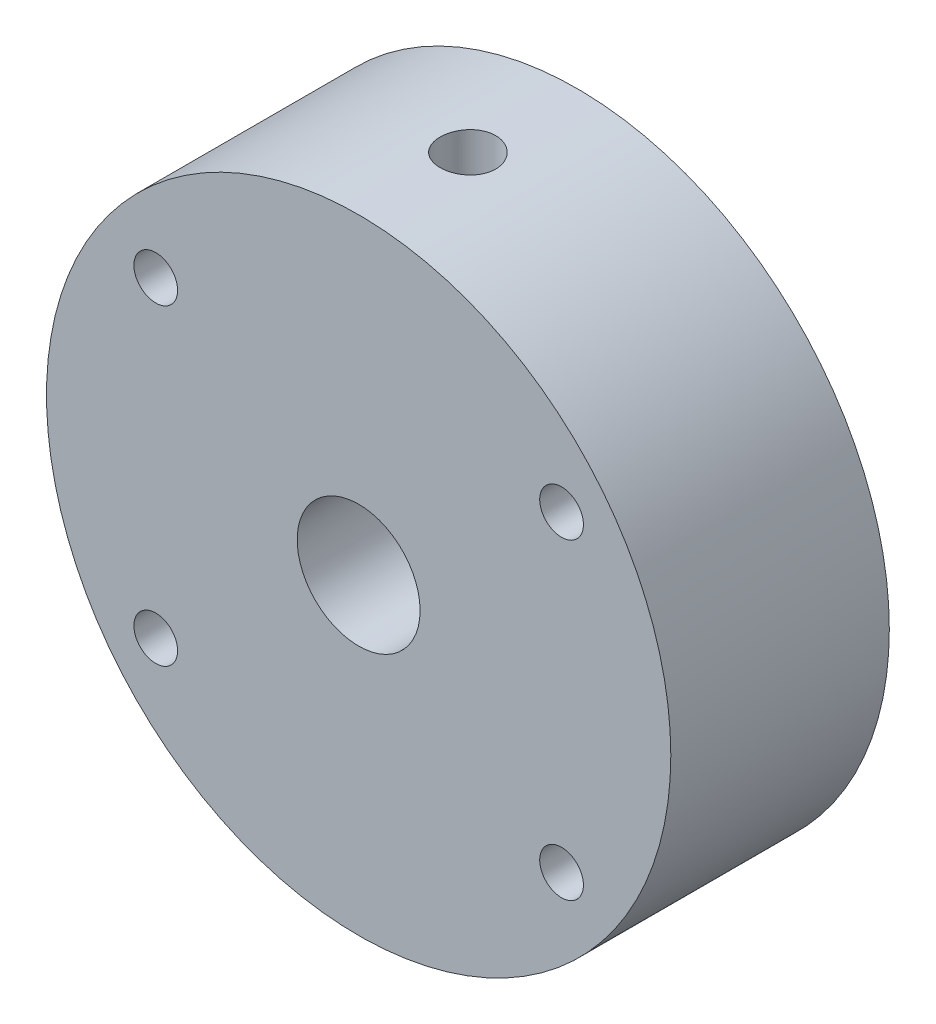
ISO-10303-21;
HEADER;
FILE_DESCRIPTION(('STEP AP214'),'2;1');
FILE_NAME('part.step','',(''),(''),'','','');
FILE_SCHEMA(('AUTOMOTIVE_DESIGN { 1 0 10303 214 1 1 1 1 }'));
ENDSEC;
DATA;
#1=APPLICATION_CONTEXT('core data for automotive mechanical design processes');
#2=APPLICATION_PROTOCOL_DEFINITION('international standard','automotive_design',2000,#1);
#3=PRODUCT_CONTEXT('',#1,'mechanical');
#4=PRODUCT('Part','Part','',(#3));
#5=PRODUCT_RELATED_PRODUCT_CATEGORY('part','',(#4));
#6=PRODUCT_DEFINITION_FORMATION('','',#4);
#7=PRODUCT_DEFINITION_CONTEXT('part definition',#1,'design');
#8=PRODUCT_DEFINITION('design','',#6,#7);
#9=PRODUCT_DEFINITION_SHAPE('','',#8);
#10=(LENGTH_UNIT() NAMED_UNIT(*) SI_UNIT(.MILLI.,.METRE.));
#11=(NAMED_UNIT(*) PLANE_ANGLE_UNIT() SI_UNIT($,.RADIAN.));
#12=(NAMED_UNIT(*) SI_UNIT($,.STERADIAN.) SOLID_ANGLE_UNIT());
#13=UNCERTAINTY_MEASURE_WITH_UNIT(LENGTH_MEASURE(1.E-05),#10,'distance_accuracy_value','');
#14=(GEOMETRIC_REPRESENTATION_CONTEXT(3) GLOBAL_UNCERTAINTY_ASSIGNED_CONTEXT((#13)) GLOBAL_UNIT_ASSIGNED_CONTEXT((#10,
#11,#12)) REPRESENTATION_CONTEXT('',''));
#15=CARTESIAN_POINT('',(0.,0.,0.));
#16=DIRECTION('',(0.,0.,1.));
#17=DIRECTION('',(1.,0.,0.));
#18=AXIS2_PLACEMENT_3D('',#15,#16,#17);
#19=CARTESIAN_POINT('',(0.,0.,8.89));
#20=DIRECTION('',(0.,0.,1.));
#21=DIRECTION('',(1.,0.,0.));
#22=AXIS2_PLACEMENT_3D('',#19,#20,#21);
#23=PLANE('',#22);
#24=CARTESIAN_POINT('',(-8.255,6.35,8.89));
#25=DIRECTION('',(0.,0.,1.));
#26=DIRECTION('',(1.,0.,0.));
#27=AXIS2_PLACEMENT_3D('',#24,#25,#26);
#28=CIRCLE('',#27,0.888999999999987);
#29=CARTESIAN_POINT('',(-7.36600000000001,6.35,8.89));
#30=VERTEX_POINT('',#29);
#31=EDGE_CURVE('E81',#30,#30,#28,.T.);
#32=ORIENTED_EDGE('',*,*,#31,.F.);
#33=EDGE_LOOP('',(#32));
#34=FACE_BOUND('',#33,.T.);
#35=CARTESIAN_POINT('',(8.255,6.35,8.89));
#36=DIRECTION('',(0.,0.,1.));
#37=DIRECTION('',(1.,0.,0.));
#38=AXIS2_PLACEMENT_3D('',#35,#36,#37);
#39=CIRCLE('',#38,0.888999999999987);
#40=CARTESIAN_POINT('',(9.14399999999999,6.35,8.89));
#41=VERTEX_POINT('',#40);
#42=EDGE_CURVE('E75',#41,#41,#39,.T.);
#43=ORIENTED_EDGE('',*,*,#42,.F.);
#44=EDGE_LOOP('',(#43));
#45=FACE_BOUND('',#44,.T.);
#46=CARTESIAN_POINT('',(8.255,-6.35,8.89));
#47=DIRECTION('',(0.,0.,1.));
#48=DIRECTION('',(1.,0.,0.));
#49=AXIS2_PLACEMENT_3D('',#46,#47,#48);
#50=CIRCLE('',#49,0.888999999999987);
#51=CARTESIAN_POINT('',(9.14399999999999,-6.35,8.89));
#52=VERTEX_POINT('',#51);
#53=EDGE_CURVE('E69',#52,#52,#50,.T.);
#54=ORIENTED_EDGE('',*,*,#53,.F.);
#55=EDGE_LOOP('',(#54));
#56=FACE_BOUND('',#55,.T.);
#57=CARTESIAN_POINT('',(-8.255,-6.35,8.89));
#58=DIRECTION('',(0.,0.,1.));
#59=DIRECTION('',(1.,0.,0.));
#60=AXIS2_PLACEMENT_3D('',#57,#58,#59);
#61=CIRCLE('',#60,0.888999999999987);
#62=CARTESIAN_POINT('',(-7.36600000000002,-6.35,8.89));
#63=VERTEX_POINT('',#62);
#64=EDGE_CURVE('E63',#63,#63,#61,.T.);
#65=ORIENTED_EDGE('',*,*,#64,.F.);
#66=EDGE_LOOP('',(#65));
#67=FACE_BOUND('',#66,.T.);
#68=CARTESIAN_POINT('',(0.,0.,8.89));
#69=DIRECTION('',(0.,0.,1.));
#70=DIRECTION('',(1.,0.,0.));
#71=AXIS2_PLACEMENT_3D('',#68,#69,#70);
#72=CIRCLE('',#71,12.7);
#73=CARTESIAN_POINT('',(12.7,0.,8.89));
#74=VERTEX_POINT('',#73);
#75=EDGE_CURVE('E44',#74,#74,#72,.T.);
#76=ORIENTED_EDGE('',*,*,#75,.T.);
#77=EDGE_LOOP('',(#76));
#78=FACE_BOUND('',#77,.T.);
#79=CARTESIAN_POINT('',(0.,0.,8.89));
#80=DIRECTION('',(0.,0.,1.));
#81=DIRECTION('',(1.,0.,0.));
#82=AXIS2_PLACEMENT_3D('',#79,#80,#81);
#83=CIRCLE('',#82,2.5);
#84=CARTESIAN_POINT('',(2.5,0.,8.89));
#85=VERTEX_POINT('',#84);
#86=EDGE_CURVE('E53',#85,#85,#83,.T.);
#87=ORIENTED_EDGE('',*,*,#86,.F.);
#88=EDGE_LOOP('',(#87));
#89=FACE_BOUND('',#88,.T.);
#90=ADVANCED_FACE('F33',(#34,#45,#56,#67,#78,#89),#23,.T.);
#91=CARTESIAN_POINT('',(0.,0.,0.));
#92=DIRECTION('',(0.,0.,1.));
#93=DIRECTION('',(1.,0.,0.));
#94=AXIS2_PLACEMENT_3D('',#91,#92,#93);
#95=PLANE('',#94);
#96=CARTESIAN_POINT('',(-8.255,6.35,0.));
#97=DIRECTION('',(0.,0.,1.));
#98=DIRECTION('',(1.,0.,0.));
#99=AXIS2_PLACEMENT_3D('',#96,#97,#98);
#100=CIRCLE('',#99,0.888999999999998);
#101=CARTESIAN_POINT('',(-7.366,6.35,0.));
#102=VERTEX_POINT('',#101);
#103=EDGE_CURVE('E78',#102,#102,#100,.T.);
#104=ORIENTED_EDGE('',*,*,#103,.T.);
#105=EDGE_LOOP('',(#104));
#106=FACE_BOUND('',#105,.T.);
#107=CARTESIAN_POINT('',(8.255,6.35,0.));
#108=DIRECTION('',(0.,0.,1.));
#109=DIRECTION('',(1.,0.,0.));
#110=AXIS2_PLACEMENT_3D('',#107,#108,#109);
#111=CIRCLE('',#110,0.888999999999997);
#112=CARTESIAN_POINT('',(9.144,6.35,0.));
#113=VERTEX_POINT('',#112);
#114=EDGE_CURVE('E72',#113,#113,#111,.T.);
#115=ORIENTED_EDGE('',*,*,#114,.T.);
#116=EDGE_LOOP('',(#115));
#117=FACE_BOUND('',#116,.T.);
#118=CARTESIAN_POINT('',(8.255,-6.35,0.));
#119=DIRECTION('',(0.,0.,1.));
#120=DIRECTION('',(1.,0.,0.));
#121=AXIS2_PLACEMENT_3D('',#118,#119,#120);
#122=CIRCLE('',#121,0.888999999999997);
#123=CARTESIAN_POINT('',(9.144,-6.35,0.));
#124=VERTEX_POINT('',#123);
#125=EDGE_CURVE('E66',#124,#124,#122,.T.);
#126=ORIENTED_EDGE('',*,*,#125,.T.);
#127=EDGE_LOOP('',(#126));
#128=FACE_BOUND('',#127,.T.);
#129=CARTESIAN_POINT('',(-8.255,-6.35,0.));
#130=DIRECTION('',(0.,0.,1.));
#131=DIRECTION('',(1.,0.,0.));
#132=AXIS2_PLACEMENT_3D('',#129,#130,#131);
#133=CIRCLE('',#132,0.888999999999998);
#134=CARTESIAN_POINT('',(-7.366,-6.35,0.));
#135=VERTEX_POINT('',#134);
#136=EDGE_CURVE('E58',#135,#135,#133,.T.);
#137=ORIENTED_EDGE('',*,*,#136,.T.);
#138=EDGE_LOOP('',(#137));
#139=FACE_BOUND('',#138,.T.);
#140=CARTESIAN_POINT('',(0.,0.,0.));
#141=DIRECTION('',(0.,0.,1.));
#142=DIRECTION('',(1.,0.,0.));
#143=AXIS2_PLACEMENT_3D('',#140,#141,#142);
#144=CIRCLE('',#143,12.7);
#145=CARTESIAN_POINT('',(12.7,0.,0.));
#146=VERTEX_POINT('',#145);
#147=EDGE_CURVE('E48',#146,#146,#144,.T.);
#148=ORIENTED_EDGE('',*,*,#147,.F.);
#149=EDGE_LOOP('',(#148));
#150=FACE_BOUND('',#149,.T.);
#151=CARTESIAN_POINT('',(0.,0.,0.));
#152=DIRECTION('',(0.,0.,1.));
#153=DIRECTION('',(1.,0.,0.));
#154=AXIS2_PLACEMENT_3D('',#151,#152,#153);
#155=CIRCLE('',#154,2.5);
#156=CARTESIAN_POINT('',(2.5,0.,0.));
#157=VERTEX_POINT('',#156);
#158=EDGE_CURVE('E55',#157,#157,#155,.T.);
#159=ORIENTED_EDGE('',*,*,#158,.T.);
#160=EDGE_LOOP('',(#159));
#161=FACE_BOUND('',#160,.T.);
#162=ADVANCED_FACE('F120',(#106,#117,#128,#139,#150,#161),#95,.F.);
#163=CARTESIAN_POINT('',(0.,0.,8.89));
#164=DIRECTION('',(0.,0.,-1.));
#165=DIRECTION('',(-1.,0.,0.));
#166=AXIS2_PLACEMENT_3D('',#163,#164,#165);
#167=CYLINDRICAL_SURFACE('',#166,12.7);
#168=CARTESIAN_POINT('',(0.,12.7,3.31470000000001));
#169=CARTESIAN_POINT('',(0.0633549662870578,12.6999993442662,3.31470275996524));
#170=CARTESIAN_POINT('',(0.126752665207346,12.6995208743728,3.32004463045691));
#171=CARTESIAN_POINT('',(0.251792843437398,12.6976581682521,3.34127511603167));
#172=CARTESIAN_POINT('',(0.313433270551566,12.6962729149133,3.3571755746525));
#173=CARTESIAN_POINT('',(0.433129919396754,12.6927531279238,3.39905879468067));
#174=CARTESIAN_POINT('',(0.491188190521169,12.6906190274599,3.42503572804752));
#175=CARTESIAN_POINT('',(0.60210692242587,12.68584065064,3.48632379024321));
#176=CARTESIAN_POINT('',(0.65496846679239,12.6831964809823,3.52163296748804));
#177=CARTESIAN_POINT('',(0.754159197131341,12.6776859812866,3.60069296418049));
#178=CARTESIAN_POINT('',(0.800471309893539,12.6748190997262,3.64446516761339));
#179=CARTESIAN_POINT('',(0.885101966605944,12.6691908973995,3.7391633345258));
#180=CARTESIAN_POINT('',(0.923420153597666,12.6664295813516,3.79008961729169));
#181=CARTESIAN_POINT('',(0.991034006795327,12.6613193372878,3.89775496911822));
#182=CARTESIAN_POINT('',(1.0203145082189,12.6589711052144,3.95450359752639));
#183=CARTESIAN_POINT('',(1.06892497046169,12.6549594154604,4.0721362454533));
#184=CARTESIAN_POINT('',(1.08825512933881,12.6532959441501,4.13302018263292));
#185=CARTESIAN_POINT('',(1.11636627626064,12.6508468875705,4.25702297237841));
#186=CARTESIAN_POINT('',(1.12517526603385,12.65005897243,4.3201354302412));
#187=CARTESIAN_POINT('',(1.13208054267278,12.6494429242787,4.44694763005313));
#188=CARTESIAN_POINT('',(1.13017705628481,12.6496147709531,4.51064735954326));
#189=CARTESIAN_POINT('',(1.11573453505945,12.6508967086965,4.63663364643222));
#190=CARTESIAN_POINT('',(1.10322597749987,12.6520041110958,4.69892372880229));
#191=CARTESIAN_POINT('',(1.06797575874834,12.6550281729631,4.82051680096642));
#192=CARTESIAN_POINT('',(1.04523398531445,12.6569448413074,4.87981975798858));
#193=CARTESIAN_POINT('',(0.990128920983868,12.661374570342,4.9938520409167));
#194=CARTESIAN_POINT('',(0.957752004966513,12.6638884745654,5.04857474850884));
#195=CARTESIAN_POINT('',(0.884305528900145,12.6692286657573,5.151820765042));
#196=CARTESIAN_POINT('',(0.843235767712836,12.6720549599532,5.20034393049405));
#197=CARTESIAN_POINT('',(0.753398711268007,12.6777134478915,5.28999064342493));
#198=CARTESIAN_POINT('',(0.704605076649215,12.6805456278451,5.33108780111356));
#199=CARTESIAN_POINT('',(0.600797098391811,12.6858874119665,5.40451170078229));
#200=CARTESIAN_POINT('',(0.545782749786353,12.6883970158769,5.43683843575969));
#201=CARTESIAN_POINT('',(0.431077483891176,12.692811467624,5.49180239672926));
#202=CARTESIAN_POINT('',(0.371385977360791,12.6947162391092,5.51443839952807));
#203=CARTESIAN_POINT('',(0.249028930160308,12.6977055702252,5.54935959074977));
#204=CARTESIAN_POINT('',(0.186363459939341,12.698790149275,5.56164502423433));
#205=CARTESIAN_POINT('',(0.0600660041406311,12.7000144007699,5.5754831265007));
#206=CARTESIAN_POINT('',(-0.00356195903673986,12.7001572813243,5.5770722351296));
#207=CARTESIAN_POINT('',(-0.130179123062568,12.6994906162937,5.56956811790858));
#208=CARTESIAN_POINT('',(-0.193168330713415,12.6986810808622,5.56047500593908));
#209=CARTESIAN_POINT('',(-0.316615641736331,12.6962026618106,5.53189477944628));
#210=CARTESIAN_POINT('',(-0.377077698751922,12.6945351793369,5.51242461024132));
#211=CARTESIAN_POINT('',(-0.493877017716603,12.6905281036814,5.46366029739495));
#212=CARTESIAN_POINT('',(-0.550214205605929,12.6881884984357,5.43436597741896));
#213=CARTESIAN_POINT('',(-0.657330068574674,12.6830912656799,5.36669373241325));
#214=CARTESIAN_POINT('',(-0.708093479326382,12.6803325372428,5.32829173027503));
#215=CARTESIAN_POINT('',(-0.802466579915459,12.6747105175415,5.24352891040849));
#216=CARTESIAN_POINT('',(-0.846076127884287,12.6718472242049,5.19716793488274));
#217=CARTESIAN_POINT('',(-0.925029072785661,12.6663292375558,5.09764477851914));
#218=CARTESIAN_POINT('',(-0.960348646577448,12.6636751596436,5.04446365961629));
#219=CARTESIAN_POINT('',(-1.0215555683374,12.6588850522987,4.9329038233009));
#220=CARTESIAN_POINT('',(-1.0474430217618,12.6567490170742,4.87452516400875));
#221=CARTESIAN_POINT('',(-1.08901049476346,12.6532404409206,4.7543109072017));
#222=CARTESIAN_POINT('',(-1.10470496682232,12.6518668193799,4.69248033987342));
#223=CARTESIAN_POINT('',(-1.12548797292162,12.6500350747212,4.56704883559887));
#224=CARTESIAN_POINT('',(-1.1305767425878,12.649576931264,4.50344793801565));
#225=CARTESIAN_POINT('',(-1.13000099869347,12.6496283581756,4.37651792687397));
#226=CARTESIAN_POINT('',(-1.12437391313382,12.6501345603107,4.31318863882937));
#227=CARTESIAN_POINT('',(-1.10260437390431,12.6520504780416,4.18837852391187));
#228=CARTESIAN_POINT('',(-1.08646190541541,12.6534601949107,4.1268976996441));
#229=CARTESIAN_POINT('',(-1.04412958765887,12.6570234016182,4.00752818113132));
#230=CARTESIAN_POINT('',(-1.01794055344363,12.6591768311197,3.94963919593201));
#231=CARTESIAN_POINT('',(-0.956262575165948,12.6639849385614,3.83907320902907));
#232=CARTESIAN_POINT('',(-0.920773746892058,12.6666396102607,3.78639614244489));
#233=CARTESIAN_POINT('',(-0.841362858948852,12.6721621485101,3.6875576054641));
#234=CARTESIAN_POINT('',(-0.797413007717867,12.6750306980048,3.64141850195347));
#235=CARTESIAN_POINT('',(-0.702379940550796,12.6806515272886,3.55715208116953));
#236=CARTESIAN_POINT('',(-0.651295006881941,12.6834037788713,3.51902669870939));
#237=CARTESIAN_POINT('',(-0.543330140990367,12.6884875727796,3.45181120811584));
#238=CARTESIAN_POINT('',(-0.486438442445036,12.6908182332511,3.42273994919049));
#239=CARTESIAN_POINT('',(-0.368598504243941,12.6947861884187,3.37460045235025));
#240=CARTESIAN_POINT('',(-0.307654989327821,12.6964242748527,3.35552078624174));
#241=CARTESIAN_POINT('',(-0.205297080416445,12.6984048358795,3.3327328905001));
#242=CARTESIAN_POINT('',(-0.164539754289082,12.6990002781437,3.32597962458262));
#243=CARTESIAN_POINT('',(-0.0825276628943302,12.6997980731845,3.31696228730164));
#244=CARTESIAN_POINT('',(-0.0412728991709899,12.7000004271809,3.31469820200731));
#245=CARTESIAN_POINT('',(0.,12.7,3.31470000000001));
#246=B_SPLINE_CURVE_WITH_KNOTS('',3,(#168,#169,#170,#171,#172,#173,#174,#175,#176,#177,#178,
#179,#180,#181,#182,#183,#184,#185,#186,#187,#188,#189,#190,#191,#192,#193,#194,#195,#196,#197,
#198,#199,#200,#201,#202,#203,#204,#205,#206,#207,#208,#209,#210,#211,#212,#213,#214,#215,#216,
#217,#218,#219,#220,#221,#222,#223,#224,#225,#226,#227,#228,#229,#230,#231,#232,#233,#234,#235,
#236,#237,#238,#239,#240,#241,#242,#243,#244,#245),.UNSPECIFIED.,.T.,.F.,(4,2,2,2,2,2,2,2,2,2,2,
2,2,2,2,2,2,2,2,2,2,2,2,2,2,2,2,2,2,2,2,2,2,2,2,2,2,2,4),(0.,0.189914200719066,
0.380041788304177,0.570059573297018,0.760037652656218,0.950502185906145,1.14097522228554,
1.33176614687074,1.52255327368612,1.71283148752738,1.90310567384788,2.09283488891786,
2.28256618506335,2.47256706685702,2.66257234544272,2.85324010665162,3.0439080200977,
3.23459999313065,3.42528745118416,3.6153249519465,3.80536042678587,3.99508652784743,
4.18481603450222,4.37505281433224,4.56529336629959,4.75607410165669,4.94685270391613,
5.13736020994908,5.32786348345201,5.51770259330725,5.70754197069814,5.89736595015787,
6.08718756629666,6.27764366067293,6.46814568561706,6.65904169388162,6.84971887938924,
6.97343978780015,7.09716031227967),.UNSPECIFIED.);
#247=CARTESIAN_POINT('',(0.,12.7,3.31470000000001));
#248=VERTEX_POINT('',#247);
#249=EDGE_CURVE('E10',#248,#248,#246,.T.);
#250=ORIENTED_EDGE('',*,*,#249,.T.);
#251=EDGE_LOOP('',(#250));
#252=FACE_BOUND('',#251,.T.);
#253=ORIENTED_EDGE('',*,*,#75,.F.);
#254=EDGE_LOOP('',(#253));
#255=FACE_BOUND('',#254,.T.);
#256=ORIENTED_EDGE('',*,*,#147,.T.);
#257=EDGE_LOOP('',(#256));
#258=FACE_BOUND('',#257,.T.);
#259=ADVANCED_FACE('F35',(#252,#255,#258),#167,.T.);
#260=CARTESIAN_POINT('',(0.,0.,8.89));
#261=DIRECTION('',(0.,0.,-1.));
#262=DIRECTION('',(-1.,0.,0.));
#263=AXIS2_PLACEMENT_3D('',#260,#261,#262);
#264=CYLINDRICAL_SURFACE('',#263,2.5);
#265=CARTESIAN_POINT('',(0.,2.5,3.31470000000001));
#266=CARTESIAN_POINT('',(0.0600822781699421,2.49999753532052,3.31470298364737));
#267=CARTESIAN_POINT('',(0.120255579793321,2.49780998569268,3.31951882375689));
#268=CARTESIAN_POINT('',(0.238864936200405,2.48927659139313,3.33858850990754));
#269=CARTESIAN_POINT('',(0.297296590206034,2.48292101568391,3.35286444312498));
#270=CARTESIAN_POINT('',(0.410519737980339,2.46672504100596,3.39020554900929));
#271=CARTESIAN_POINT('',(0.465323560820435,2.45689724977841,3.41323894574639));
#272=CARTESIAN_POINT('',(0.57022644784853,2.43469105852836,3.46729631502717));
#273=CARTESIAN_POINT('',(0.620326483486104,2.42231318685542,3.49831863268365));
#274=CARTESIAN_POINT('',(0.717343781540011,2.39542952734409,3.56933124856344));
#275=CARTESIAN_POINT('',(0.76395880834863,2.38084643173633,3.60970485852565));
#276=CARTESIAN_POINT('',(0.850024413058929,2.35149528944333,3.69745891346146));
#277=CARTESIAN_POINT('',(0.88947057087648,2.33672713461405,3.7448436488203));
#278=CARTESIAN_POINT('',(0.962442756535042,2.30766976105589,3.84872165322517));
#279=CARTESIAN_POINT('',(0.995468844501711,2.29346302025365,3.90559172098653));
#280=CARTESIAN_POINT('',(1.05135258954231,2.26839208577814,4.02480711981233));
#281=CARTESIAN_POINT('',(1.07421637599037,2.25752587849092,4.08714912324015));
#282=CARTESIAN_POINT('',(1.10782476642697,2.24121806115519,4.21207021325406));
#283=CARTESIAN_POINT('',(1.11915487795904,2.2355162032548,4.27445633433168));
#284=CARTESIAN_POINT('',(1.1311921664553,2.22945167708961,4.40048425859117));
#285=CARTESIAN_POINT('',(1.13190682591099,2.22908524805582,4.4641251456422));
#286=CARTESIAN_POINT('',(1.12312848632353,2.23351683738999,4.58449967062771));
#287=CARTESIAN_POINT('',(1.11458166981261,2.23783618785691,4.64132375366868));
#288=CARTESIAN_POINT('',(1.08913130633431,2.25033149246957,4.75262215553049));
#289=CARTESIAN_POINT('',(1.07222579369702,2.25850835374474,4.80709591836134));
#290=CARTESIAN_POINT('',(1.03020341851955,2.27798715558767,4.91362997925537));
#291=CARTESIAN_POINT('',(1.00490890992585,2.28935580707385,4.96560744836774));
#292=CARTESIAN_POINT('',(0.946955134909238,2.31392853665228,5.06480436894356));
#293=CARTESIAN_POINT('',(0.91429272259136,2.3271333978298,5.11202177549249));
#294=CARTESIAN_POINT('',(0.838661167836848,2.3555119211023,5.20538786608806));
#295=CARTESIAN_POINT('',(0.794983554799027,2.37074960054508,5.25094499465127));
#296=CARTESIAN_POINT('',(0.700488055365265,2.40036815772633,5.33430632116738));
#297=CARTESIAN_POINT('',(0.649667868974443,2.41474875734216,5.37210801209288));
#298=CARTESIAN_POINT('',(0.540258539490566,2.441595329966,5.43997192775731));
#299=CARTESIAN_POINT('',(0.481474906305863,2.45398660301872,5.46975241978004));
#300=CARTESIAN_POINT('',(0.359027896950456,2.4748626594719,5.51878693100977));
#301=CARTESIAN_POINT('',(0.29536773601109,2.48334999142515,5.53804781911949));
#302=CARTESIAN_POINT('',(0.16988113433702,2.49495947814047,5.56416339321779));
#303=CARTESIAN_POINT('',(0.108251060572749,2.49842301024102,5.57180934506845));
#304=CARTESIAN_POINT('',(-0.015505482758476,2.50071674189136,5.57688731899755));
#305=CARTESIAN_POINT('',(-0.0776317679084566,2.49954858951989,5.57432297417462));
#306=CARTESIAN_POINT('',(-0.196637407064394,2.49292468795018,5.55958039305622));
#307=CARTESIAN_POINT('',(-0.25360660526838,2.48773299827167,5.54799404419534));
#308=CARTESIAN_POINT('',(-0.364708953054157,2.47388829633388,5.5164020169418));
#309=CARTESIAN_POINT('',(-0.418841761367811,2.46523486864258,5.49639532803629));
#310=CARTESIAN_POINT('',(-0.524649476351217,2.44494100839571,5.44790258180561));
#311=CARTESIAN_POINT('',(-0.576195720898967,2.43321610703453,5.41917233627273));
#312=CARTESIAN_POINT('',(-0.673920744470043,2.40798300337697,5.35431410804281));
#313=CARTESIAN_POINT('',(-0.72009715869568,2.39447402094728,5.31818288525615));
#314=CARTESIAN_POINT('',(-0.809820978251053,2.365711336932,5.23605457029221));
#315=CARTESIAN_POINT('',(-0.85283099063724,2.35040593918311,5.18948711526758));
#316=CARTESIAN_POINT('',(-0.930615104407228,2.32070956290476,5.08962497065195));
#317=CARTESIAN_POINT('',(-0.965385953108911,2.30631894715077,5.03632763690474));
#318=CARTESIAN_POINT('',(-1.0265035925915,2.27978800760565,4.92263965154966));
#319=CARTESIAN_POINT('',(-1.05260357478991,2.26771717388814,4.86209880758884));
#320=CARTESIAN_POINT('',(-1.09398365543882,2.24805111549491,4.73675635585288));
#321=CARTESIAN_POINT('',(-1.10927481970081,2.24045131482283,4.67195918012789));
#322=CARTESIAN_POINT('',(-1.12741784093358,2.23137234406808,4.54599094781284));
#323=CARTESIAN_POINT('',(-1.13123346685628,2.22941953274959,4.48499275335847));
#324=CARTESIAN_POINT('',(-1.12898055369407,2.23056169824744,4.36323473782514));
#325=CARTESIAN_POINT('',(-1.12291432965375,2.23365549278361,4.30247486425674));
#326=CARTESIAN_POINT('',(-1.10192249763591,2.24407859716409,4.18699048568165));
#327=CARTESIAN_POINT('',(-1.08759230069689,2.25112244914719,4.13212924181349));
#328=CARTESIAN_POINT('',(-1.05112132051271,2.26838018341276,4.02560276923034));
#329=CARTESIAN_POINT('',(-1.02897825847537,2.27859499046872,3.9739384781493));
#330=CARTESIAN_POINT('',(-0.97586874348625,2.3018625679474,3.8715931762647));
#331=CARTESIAN_POINT('',(-0.944422675042856,2.31505655938752,3.82119390664891));
#332=CARTESIAN_POINT('',(-0.874209588312666,2.34247247324534,3.72608905199813));
#333=CARTESIAN_POINT('',(-0.835439380820093,2.35669484178566,3.68138596154656));
#334=CARTESIAN_POINT('',(-0.747475338300102,2.38613100197327,3.59469878409871));
#335=CARTESIAN_POINT('',(-0.697651312674876,2.40131593750279,3.55334111598853));
#336=CARTESIAN_POINT('',(-0.591249054874762,2.42970215828352,3.47949755540008));
#337=CARTESIAN_POINT('',(-0.534667723564206,2.44290252702554,3.44701575633361));
#338=CARTESIAN_POINT('',(-0.416728451415863,2.46574755679697,3.39233604392595));
#339=CARTESIAN_POINT('',(-0.355420635337768,2.47542460250943,3.37004395950359));
#340=CARTESIAN_POINT('',(-0.229471002212837,2.49024775142017,3.33633193047554));
#341=CARTESIAN_POINT('',(-0.164839905116672,2.49540756097344,3.32487908843139));
#342=CARTESIAN_POINT('',(-0.0831472137592136,2.49867280408139,3.31763860093723));
#343=CARTESIAN_POINT('',(-0.0665428536369048,2.49916960292581,3.31653770775896));
#344=CARTESIAN_POINT('',(-0.033294659683081,2.49983354479593,3.31506798855285));
#345=CARTESIAN_POINT('',(-0.0166508252831942,2.50000068304579,3.31469917313071));
#346=CARTESIAN_POINT('',(0.,2.5,3.31470000000001));
#347=B_SPLINE_CURVE_WITH_KNOTS('',3,(#265,#266,#267,#268,#269,#270,#271,#272,#273,#274,#275,
#276,#277,#278,#279,#280,#281,#282,#283,#284,#285,#286,#287,#288,#289,#290,#291,#292,#293,#294,
#295,#296,#297,#298,#299,#300,#301,#302,#303,#304,#305,#306,#307,#308,#309,#310,#311,#312,#313,
#314,#315,#316,#317,#318,#319,#320,#321,#322,#323,#324,#325,#326,#327,#328,#329,#330,#331,#332,
#333,#334,#335,#336,#337,#338,#339,#340,#341,#342,#343,#344,#345,#346),.UNSPECIFIED.,.T.,.F.,(4,
2,2,2,2,2,2,2,2,2,2,2,2,2,2,2,2,2,2,2,2,2,2,2,2,2,2,2,2,2,2,2,2,2,2,2,2,2,2,2,4),(0.,
0.18017852828696,0.360779221863851,0.540730775548946,0.720645082613013,0.909941937909634,
1.0993551142356,1.30018149963434,1.50088659203675,1.69080053665015,1.88058061066136,
2.05265365697004,2.22476718803771,2.40078676336933,2.57688163701785,2.77079443678602,
2.96476982249504,3.16486368818609,3.36482674348611,3.55043670236245,3.73598062211844,
3.91028304037041,4.08460638237139,4.26434709700546,4.44416666953937,4.63893005127564,
4.83377019466563,5.03375752759586,5.23353982053461,5.41599643659576,5.59841031425673,
5.7690822652223,5.9398040375847,6.12161266230149,6.30350063657832,6.50208743663037,
6.70076566782371,6.89756866886193,7.09377243289049,7.14370525540411,7.19363880129601),.UNSPECIFIED.);
#348=CARTESIAN_POINT('',(0.,2.5,3.31470000000001));
#349=VERTEX_POINT('',#348);
#350=EDGE_CURVE('E84',#349,#349,#347,.T.);
#351=ORIENTED_EDGE('',*,*,#350,.F.);
#352=EDGE_LOOP('',(#351));
#353=FACE_BOUND('',#352,.T.);
#354=ORIENTED_EDGE('',*,*,#86,.T.);
#355=EDGE_LOOP('',(#354));
#356=FACE_BOUND('',#355,.T.);
#357=ORIENTED_EDGE('',*,*,#158,.F.);
#358=EDGE_LOOP('',(#357));
#359=FACE_BOUND('',#358,.T.);
#360=ADVANCED_FACE('F89',(#353,#356,#359),#264,.F.);
#361=CARTESIAN_POINT('',(-8.255,-6.35,8.89));
#362=DIRECTION('',(0.,0.,1.));
#363=DIRECTION('',(1.,0.,0.));
#364=AXIS2_PLACEMENT_3D('',#361,#362,#363);
#365=CYLINDRICAL_SURFACE('',#364,0.888999999999993);
#366=ORIENTED_EDGE('',*,*,#136,.F.);
#367=EDGE_LOOP('',(#366));
#368=FACE_BOUND('',#367,.T.);
#369=ORIENTED_EDGE('',*,*,#64,.T.);
#370=EDGE_LOOP('',(#369));
#371=FACE_BOUND('',#370,.T.);
#372=ADVANCED_FACE('F109',(#368,#371),#365,.F.);
#373=CARTESIAN_POINT('',(8.255,-6.35,8.89));
#374=DIRECTION('',(0.,0.,1.));
#375=DIRECTION('',(1.,0.,0.));
#376=AXIS2_PLACEMENT_3D('',#373,#374,#375);
#377=CYLINDRICAL_SURFACE('',#376,0.888999999999992);
#378=ORIENTED_EDGE('',*,*,#125,.F.);
#379=EDGE_LOOP('',(#378));
#380=FACE_BOUND('',#379,.T.);
#381=ORIENTED_EDGE('',*,*,#53,.T.);
#382=EDGE_LOOP('',(#381));
#383=FACE_BOUND('',#382,.T.);
#384=ADVANCED_FACE('F106',(#380,#383),#377,.F.);
#385=CARTESIAN_POINT('',(8.255,6.35,8.89));
#386=DIRECTION('',(0.,0.,1.));
#387=DIRECTION('',(1.,0.,0.));
#388=AXIS2_PLACEMENT_3D('',#385,#386,#387);
#389=CYLINDRICAL_SURFACE('',#388,0.888999999999992);
#390=ORIENTED_EDGE('',*,*,#114,.F.);
#391=EDGE_LOOP('',(#390));
#392=FACE_BOUND('',#391,.T.);
#393=ORIENTED_EDGE('',*,*,#42,.T.);
#394=EDGE_LOOP('',(#393));
#395=FACE_BOUND('',#394,.T.);
#396=ADVANCED_FACE('F102',(#392,#395),#389,.F.);
#397=CARTESIAN_POINT('',(-8.255,6.35,8.89));
#398=DIRECTION('',(0.,0.,1.));
#399=DIRECTION('',(1.,0.,0.));
#400=AXIS2_PLACEMENT_3D('',#397,#398,#399);
#401=CYLINDRICAL_SURFACE('',#400,0.888999999999993);
#402=ORIENTED_EDGE('',*,*,#103,.F.);
#403=EDGE_LOOP('',(#402));
#404=FACE_BOUND('',#403,.T.);
#405=ORIENTED_EDGE('',*,*,#31,.T.);
#406=EDGE_LOOP('',(#405));
#407=FACE_BOUND('',#406,.T.);
#408=ADVANCED_FACE('F97',(#404,#407),#401,.F.);
#409=CARTESIAN_POINT('',(0.,0.,4.445));
#410=DIRECTION('',(0.,-1.,0.));
#411=DIRECTION('',(0.,0.,-1.));
#412=AXIS2_PLACEMENT_3D('',#409,#410,#411);
#413=CYLINDRICAL_SURFACE('',#412,1.13029999999999);
#414=ORIENTED_EDGE('',*,*,#350,.T.);
#415=EDGE_LOOP('',(#414));
#416=FACE_BOUND('',#415,.T.);
#417=ORIENTED_EDGE('',*,*,#249,.F.);
#418=EDGE_LOOP('',(#417));
#419=FACE_BOUND('',#418,.T.);
#420=ADVANCED_FACE('F93',(#416,#419),#413,.F.);
#421=CLOSED_SHELL('',(#90,#162,#259,#360,#372,#384,#396,#408,#420));
#422=MANIFOLD_SOLID_BREP('B2',#421);
#423=ADVANCED_BREP_SHAPE_REPRESENTATION('',(#18,#422),#14);
#424=SHAPE_DEFINITION_REPRESENTATION(#9,#423);
ENDSEC;
END-ISO-10303-21;
